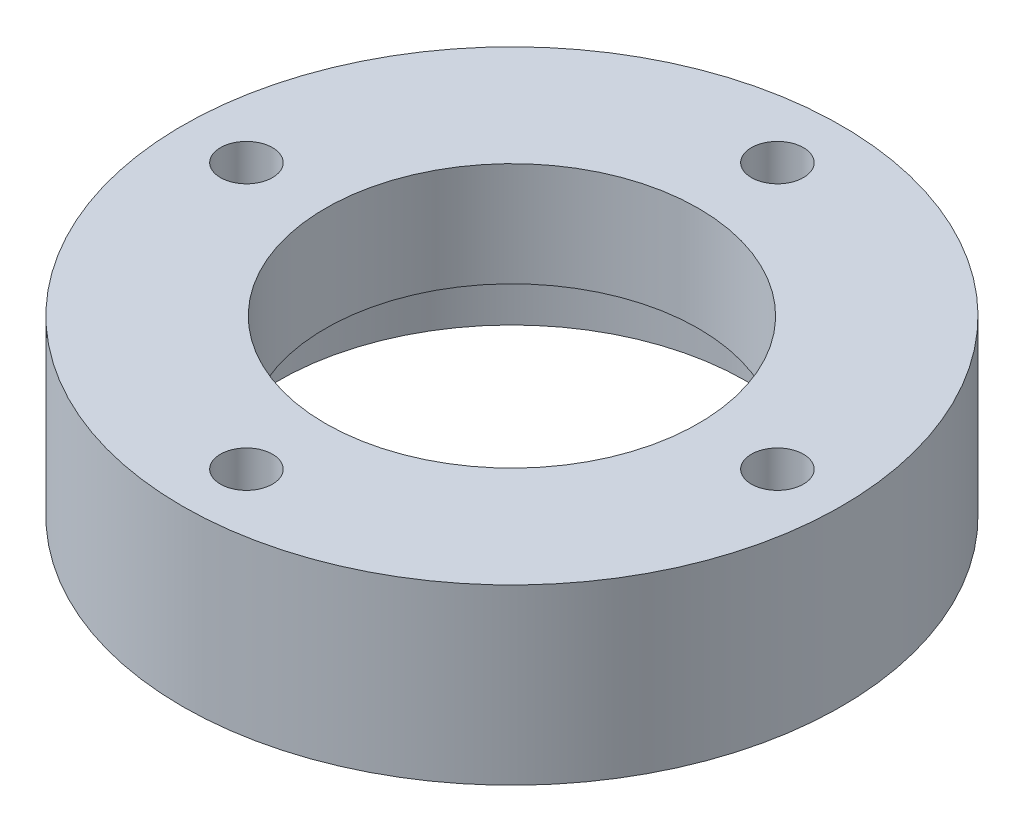
ISO-10303-21;
HEADER;
FILE_DESCRIPTION(('STEP AP214'),'2;1');
FILE_NAME('part.step','',(''),(''),'','','');
FILE_SCHEMA(('AUTOMOTIVE_DESIGN { 1 0 10303 214 1 1 1 1 }'));
ENDSEC;
DATA;
#1=APPLICATION_CONTEXT('core data for automotive mechanical design processes');
#2=APPLICATION_PROTOCOL_DEFINITION('international standard','automotive_design',2000,#1);
#3=PRODUCT_CONTEXT('',#1,'mechanical');
#4=PRODUCT('Part','Part','',(#3));
#5=PRODUCT_RELATED_PRODUCT_CATEGORY('part','',(#4));
#6=PRODUCT_DEFINITION_FORMATION('','',#4);
#7=PRODUCT_DEFINITION_CONTEXT('part definition',#1,'design');
#8=PRODUCT_DEFINITION('design','',#6,#7);
#9=PRODUCT_DEFINITION_SHAPE('','',#8);
#10=(LENGTH_UNIT() NAMED_UNIT(*) SI_UNIT(.MILLI.,.METRE.));
#11=(NAMED_UNIT(*) PLANE_ANGLE_UNIT() SI_UNIT($,.RADIAN.));
#12=(NAMED_UNIT(*) SI_UNIT($,.STERADIAN.) SOLID_ANGLE_UNIT());
#13=UNCERTAINTY_MEASURE_WITH_UNIT(LENGTH_MEASURE(1.E-05),#10,'distance_accuracy_value','');
#14=(GEOMETRIC_REPRESENTATION_CONTEXT(3) GLOBAL_UNCERTAINTY_ASSIGNED_CONTEXT((#13)) GLOBAL_UNIT_ASSIGNED_CONTEXT((#10,
#11,#12)) REPRESENTATION_CONTEXT('',''));
#15=CARTESIAN_POINT('',(0.,0.,0.));
#16=DIRECTION('',(0.,0.,1.));
#17=DIRECTION('',(1.,0.,0.));
#18=AXIS2_PLACEMENT_3D('',#15,#16,#17);
#19=CARTESIAN_POINT('',(0.,10.,0.));
#20=DIRECTION('',(0.,-1.,0.));
#21=DIRECTION('',(0.,0.,-1.));
#22=AXIS2_PLACEMENT_3D('',#19,#20,#21);
#23=CYLINDRICAL_SURFACE('',#22,10.75);
#24=CARTESIAN_POINT('',(0.,10.,0.));
#25=DIRECTION('',(0.,1.,0.));
#26=DIRECTION('',(0.,0.,1.));
#27=AXIS2_PLACEMENT_3D('',#24,#25,#26);
#28=CIRCLE('',#27,10.75);
#29=CARTESIAN_POINT('',(0.,10.,10.75));
#30=VERTEX_POINT('',#29);
#31=EDGE_CURVE('E42',#30,#30,#28,.T.);
#32=ORIENTED_EDGE('',*,*,#31,.T.);
#33=EDGE_LOOP('',(#32));
#34=FACE_BOUND('',#33,.T.);
#35=CARTESIAN_POINT('',(0.,3.99999999999999,0.));
#36=DIRECTION('',(0.,-1.,0.));
#37=DIRECTION('',(0.,0.,-1.));
#38=AXIS2_PLACEMENT_3D('',#35,#36,#37);
#39=CIRCLE('',#38,10.75);
#40=CARTESIAN_POINT('',(0.,3.99999999999999,-10.75));
#41=VERTEX_POINT('',#40);
#42=EDGE_CURVE('E33',#41,#41,#39,.T.);
#43=ORIENTED_EDGE('',*,*,#42,.T.);
#44=EDGE_LOOP('',(#43));
#45=FACE_BOUND('',#44,.T.);
#46=ADVANCED_FACE('F29',(#34,#45),#23,.F.);
#47=CARTESIAN_POINT('',(0.,10.,0.));
#48=DIRECTION('',(0.,1.,0.));
#49=DIRECTION('',(0.,0.,1.));
#50=AXIS2_PLACEMENT_3D('',#47,#48,#49);
#51=PLANE('',#50);
#52=CARTESIAN_POINT('',(-15.3050221528031,10.,2.23497457874543E-13));
#53=DIRECTION('',(0.,1.,0.));
#54=DIRECTION('',(0.,0.,1.));
#55=AXIS2_PLACEMENT_3D('',#52,#53,#54);
#56=CIRCLE('',#55,1.50000000000054);
#57=CARTESIAN_POINT('',(-15.3050221528031,10.,1.50000000000076));
#58=VERTEX_POINT('',#57);
#59=EDGE_CURVE('E71',#58,#58,#56,.T.);
#60=ORIENTED_EDGE('',*,*,#59,.F.);
#61=EDGE_LOOP('',(#60));
#62=FACE_BOUND('',#61,.T.);
#63=CARTESIAN_POINT('',(4.50743565027148E-13,10.,15.3050221528034));
#64=DIRECTION('',(0.,1.,0.));
#65=DIRECTION('',(0.,0.,1.));
#66=AXIS2_PLACEMENT_3D('',#63,#64,#65);
#67=CIRCLE('',#66,1.50000000000054);
#68=CARTESIAN_POINT('',(4.50743565027148E-13,10.,16.8050221528039));
#69=VERTEX_POINT('',#68);
#70=EDGE_CURVE('E65',#69,#69,#67,.T.);
#71=ORIENTED_EDGE('',*,*,#70,.F.);
#72=EDGE_LOOP('',(#71));
#73=FACE_BOUND('',#72,.T.);
#74=CARTESIAN_POINT('',(15.3050221528036,10.,-2.25371782513574E-13));
#75=DIRECTION('',(0.,1.,0.));
#76=DIRECTION('',(0.,0.,1.));
#77=AXIS2_PLACEMENT_3D('',#74,#75,#76);
#78=CIRCLE('',#77,1.50000000000054);
#79=CARTESIAN_POINT('',(15.3050221528036,10.,1.50000000000031));
#80=VERTEX_POINT('',#79);
#81=EDGE_CURVE('E59',#80,#80,#78,.T.);
#82=ORIENTED_EDGE('',*,*,#81,.F.);
#83=EDGE_LOOP('',(#82));
#84=FACE_BOUND('',#83,.T.);
#85=CARTESIAN_POINT('',(0.,10.,-15.3050221528034));
#86=DIRECTION('',(0.,1.,0.));
#87=DIRECTION('',(0.,0.,1.));
#88=AXIS2_PLACEMENT_3D('',#85,#86,#87);
#89=CIRCLE('',#88,1.50000000000054);
#90=CARTESIAN_POINT('',(0.,10.,-13.8050221528028));
#91=VERTEX_POINT('',#90);
#92=EDGE_CURVE('E53',#91,#91,#89,.T.);
#93=ORIENTED_EDGE('',*,*,#92,.F.);
#94=EDGE_LOOP('',(#93));
#95=FACE_BOUND('',#94,.T.);
#96=CARTESIAN_POINT('',(0.,10.,0.));
#97=DIRECTION('',(0.,1.,0.));
#98=DIRECTION('',(0.,0.,1.));
#99=AXIS2_PLACEMENT_3D('',#96,#97,#98);
#100=CIRCLE('',#99,19.);
#101=CARTESIAN_POINT('',(0.,10.,19.));
#102=VERTEX_POINT('',#101);
#103=EDGE_CURVE('E10',#102,#102,#100,.T.);
#104=ORIENTED_EDGE('',*,*,#103,.T.);
#105=EDGE_LOOP('',(#104));
#106=FACE_BOUND('',#105,.T.);
#107=ORIENTED_EDGE('',*,*,#31,.F.);
#108=EDGE_LOOP('',(#107));
#109=FACE_BOUND('',#108,.T.);
#110=ADVANCED_FACE('F87',(#62,#73,#84,#95,#106,#109),#51,.T.);
#111=CARTESIAN_POINT('',(0.,0.,0.));
#112=DIRECTION('',(0.,1.,0.));
#113=DIRECTION('',(0.,0.,1.));
#114=AXIS2_PLACEMENT_3D('',#111,#112,#113);
#115=PLANE('',#114);
#116=CARTESIAN_POINT('',(-15.3050221528031,0.,2.23497457874543E-13));
#117=DIRECTION('',(0.,1.,0.));
#118=DIRECTION('',(0.,0.,1.));
#119=AXIS2_PLACEMENT_3D('',#116,#117,#118);
#120=CIRCLE('',#119,1.50000000000054);
#121=CARTESIAN_POINT('',(-15.3050221528031,0.,1.50000000000076));
#122=VERTEX_POINT('',#121);
#123=EDGE_CURVE('E68',#122,#122,#120,.T.);
#124=ORIENTED_EDGE('',*,*,#123,.T.);
#125=EDGE_LOOP('',(#124));
#126=FACE_BOUND('',#125,.T.);
#127=CARTESIAN_POINT('',(4.50743565027148E-13,0.,15.3050221528034));
#128=DIRECTION('',(0.,1.,0.));
#129=DIRECTION('',(0.,0.,1.));
#130=AXIS2_PLACEMENT_3D('',#127,#128,#129);
#131=CIRCLE('',#130,1.50000000000054);
#132=CARTESIAN_POINT('',(4.50743565027148E-13,0.,16.8050221528039));
#133=VERTEX_POINT('',#132);
#134=EDGE_CURVE('E62',#133,#133,#131,.T.);
#135=ORIENTED_EDGE('',*,*,#134,.T.);
#136=EDGE_LOOP('',(#135));
#137=FACE_BOUND('',#136,.T.);
#138=CARTESIAN_POINT('',(15.3050221528036,0.,-2.25371782513574E-13));
#139=DIRECTION('',(0.,1.,0.));
#140=DIRECTION('',(0.,0.,1.));
#141=AXIS2_PLACEMENT_3D('',#138,#139,#140);
#142=CIRCLE('',#141,1.50000000000054);
#143=CARTESIAN_POINT('',(15.3050221528036,0.,1.50000000000031));
#144=VERTEX_POINT('',#143);
#145=EDGE_CURVE('E56',#144,#144,#142,.T.);
#146=ORIENTED_EDGE('',*,*,#145,.T.);
#147=EDGE_LOOP('',(#146));
#148=FACE_BOUND('',#147,.T.);
#149=CARTESIAN_POINT('',(0.,0.,-15.3050221528034));
#150=DIRECTION('',(0.,1.,0.));
#151=DIRECTION('',(0.,0.,1.));
#152=AXIS2_PLACEMENT_3D('',#149,#150,#151);
#153=CIRCLE('',#152,1.50000000000054);
#154=CARTESIAN_POINT('',(0.,0.,-13.8050221528028));
#155=VERTEX_POINT('',#154);
#156=EDGE_CURVE('E50',#155,#155,#153,.T.);
#157=ORIENTED_EDGE('',*,*,#156,.T.);
#158=EDGE_LOOP('',(#157));
#159=FACE_BOUND('',#158,.T.);
#160=CARTESIAN_POINT('',(0.,0.,0.));
#161=DIRECTION('',(0.,-1.,0.));
#162=DIRECTION('',(0.,0.,-1.));
#163=AXIS2_PLACEMENT_3D('',#160,#161,#162);
#164=CIRCLE('',#163,13.5);
#165=CARTESIAN_POINT('',(0.,0.,-13.5));
#166=VERTEX_POINT('',#165);
#167=EDGE_CURVE('E46',#166,#166,#164,.T.);
#168=ORIENTED_EDGE('',*,*,#167,.F.);
#169=EDGE_LOOP('',(#168));
#170=FACE_BOUND('',#169,.T.);
#171=CARTESIAN_POINT('',(0.,0.,0.));
#172=DIRECTION('',(0.,1.,0.));
#173=DIRECTION('',(0.,0.,1.));
#174=AXIS2_PLACEMENT_3D('',#171,#172,#173);
#175=CIRCLE('',#174,19.);
#176=CARTESIAN_POINT('',(0.,0.,19.));
#177=VERTEX_POINT('',#176);
#178=EDGE_CURVE('E37',#177,#177,#175,.T.);
#179=ORIENTED_EDGE('',*,*,#178,.F.);
#180=EDGE_LOOP('',(#179));
#181=FACE_BOUND('',#180,.T.);
#182=ADVANCED_FACE('F77',(#126,#137,#148,#159,#170,#181),#115,.F.);
#183=CARTESIAN_POINT('',(0.,10.,0.));
#184=DIRECTION('',(0.,-1.,0.));
#185=DIRECTION('',(0.,0.,-1.));
#186=AXIS2_PLACEMENT_3D('',#183,#184,#185);
#187=CYLINDRICAL_SURFACE('',#186,19.);
#188=ORIENTED_EDGE('',*,*,#103,.F.);
#189=EDGE_LOOP('',(#188));
#190=FACE_BOUND('',#189,.T.);
#191=ORIENTED_EDGE('',*,*,#178,.T.);
#192=EDGE_LOOP('',(#191));
#193=FACE_BOUND('',#192,.T.);
#194=ADVANCED_FACE('F31',(#190,#193),#187,.T.);
#195=CARTESIAN_POINT('',(0.,3.99999999999999,0.));
#196=DIRECTION('',(0.,-1.,0.));
#197=DIRECTION('',(0.,0.,-1.));
#198=AXIS2_PLACEMENT_3D('',#195,#196,#197);
#199=CYLINDRICAL_SURFACE('',#198,13.5);
#200=CARTESIAN_POINT('',(0.,3.99999999999999,0.));
#201=DIRECTION('',(0.,-1.,0.));
#202=DIRECTION('',(0.,0.,-1.));
#203=AXIS2_PLACEMENT_3D('',#200,#201,#202);
#204=CIRCLE('',#203,13.5);
#205=CARTESIAN_POINT('',(0.,3.99999999999999,-13.5));
#206=VERTEX_POINT('',#205);
#207=EDGE_CURVE('E49',#206,#206,#204,.T.);
#208=ORIENTED_EDGE('',*,*,#207,.F.);
#209=EDGE_LOOP('',(#208));
#210=FACE_BOUND('',#209,.T.);
#211=ORIENTED_EDGE('',*,*,#167,.T.);
#212=EDGE_LOOP('',(#211));
#213=FACE_BOUND('',#212,.T.);
#214=ADVANCED_FACE('F109',(#210,#213),#199,.F.);
#215=CARTESIAN_POINT('',(0.,3.99999999999999,0.));
#216=DIRECTION('',(0.,-1.,0.));
#217=DIRECTION('',(0.,0.,-1.));
#218=AXIS2_PLACEMENT_3D('',#215,#216,#217);
#219=PLANE('',#218);
#220=ORIENTED_EDGE('',*,*,#42,.F.);
#221=EDGE_LOOP('',(#220));
#222=FACE_BOUND('',#221,.T.);
#223=ORIENTED_EDGE('',*,*,#207,.T.);
#224=EDGE_LOOP('',(#223));
#225=FACE_BOUND('',#224,.T.);
#226=ADVANCED_FACE('F105',(#222,#225),#219,.T.);
#227=CARTESIAN_POINT('',(0.,0.,-15.3050221528034));
#228=DIRECTION('',(0.,1.,0.));
#229=DIRECTION('',(0.,0.,1.));
#230=AXIS2_PLACEMENT_3D('',#227,#228,#229);
#231=CYLINDRICAL_SURFACE('',#230,1.50000000000054);
#232=ORIENTED_EDGE('',*,*,#156,.F.);
#233=EDGE_LOOP('',(#232));
#234=FACE_BOUND('',#233,.T.);
#235=ORIENTED_EDGE('',*,*,#92,.T.);
#236=EDGE_LOOP('',(#235));
#237=FACE_BOUND('',#236,.T.);
#238=ADVANCED_FACE('F108',(#234,#237),#231,.F.);
#239=CARTESIAN_POINT('',(15.3050221528036,0.,-2.25371782513574E-13));
#240=DIRECTION('',(0.,1.,0.));
#241=DIRECTION('',(0.,0.,1.));
#242=AXIS2_PLACEMENT_3D('',#239,#240,#241);
#243=CYLINDRICAL_SURFACE('',#242,1.50000000000054);
#244=ORIENTED_EDGE('',*,*,#145,.F.);
#245=EDGE_LOOP('',(#244));
#246=FACE_BOUND('',#245,.T.);
#247=ORIENTED_EDGE('',*,*,#81,.T.);
#248=EDGE_LOOP('',(#247));
#249=FACE_BOUND('',#248,.T.);
#250=ADVANCED_FACE('F144',(#246,#249),#243,.F.);
#251=CARTESIAN_POINT('',(4.50743565027148E-13,0.,15.3050221528034));
#252=DIRECTION('',(0.,1.,0.));
#253=DIRECTION('',(0.,0.,1.));
#254=AXIS2_PLACEMENT_3D('',#251,#252,#253);
#255=CYLINDRICAL_SURFACE('',#254,1.50000000000054);
#256=ORIENTED_EDGE('',*,*,#134,.F.);
#257=EDGE_LOOP('',(#256));
#258=FACE_BOUND('',#257,.T.);
#259=ORIENTED_EDGE('',*,*,#70,.T.);
#260=EDGE_LOOP('',(#259));
#261=FACE_BOUND('',#260,.T.);
#262=ADVANCED_FACE('F83',(#258,#261),#255,.F.);
#263=CARTESIAN_POINT('',(-15.3050221528031,0.,2.23497457874543E-13));
#264=DIRECTION('',(0.,1.,0.));
#265=DIRECTION('',(0.,0.,1.));
#266=AXIS2_PLACEMENT_3D('',#263,#264,#265);
#267=CYLINDRICAL_SURFACE('',#266,1.50000000000054);
#268=ORIENTED_EDGE('',*,*,#123,.F.);
#269=EDGE_LOOP('',(#268));
#270=FACE_BOUND('',#269,.T.);
#271=ORIENTED_EDGE('',*,*,#59,.T.);
#272=EDGE_LOOP('',(#271));
#273=FACE_BOUND('',#272,.T.);
#274=ADVANCED_FACE('F80',(#270,#273),#267,.F.);
#275=CLOSED_SHELL('',(#46,#110,#182,#194,#214,#226,#238,#250,#262,#274));
#276=MANIFOLD_SOLID_BREP('B2',#275);
#277=ADVANCED_BREP_SHAPE_REPRESENTATION('',(#18,#276),#14);
#278=SHAPE_DEFINITION_REPRESENTATION(#9,#277);
ENDSEC;
END-ISO-10303-21;
